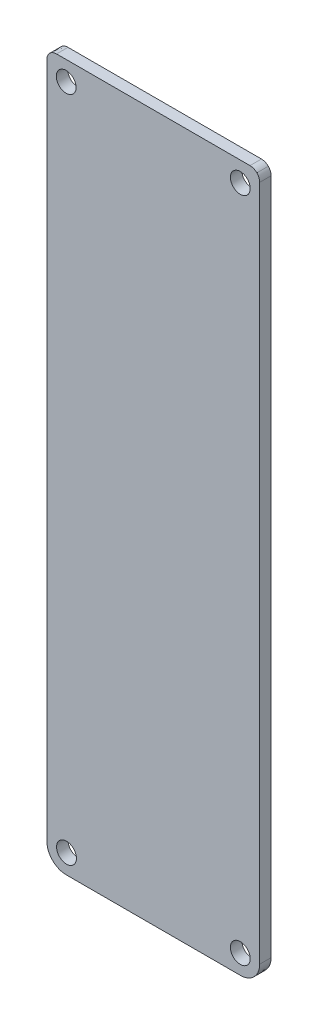
ISO-10303-21;
HEADER;
FILE_DESCRIPTION(('STEP AP214'),'2;1');
FILE_NAME('part.step','',(''),(''),'','','');
FILE_SCHEMA(('AUTOMOTIVE_DESIGN { 1 0 10303 214 1 1 1 1 }'));
ENDSEC;
DATA;
#1=APPLICATION_CONTEXT('core data for automotive mechanical design processes');
#2=APPLICATION_PROTOCOL_DEFINITION('international standard','automotive_design',2000,#1);
#3=PRODUCT_CONTEXT('',#1,'mechanical');
#4=PRODUCT('Part','Part','',(#3));
#5=PRODUCT_RELATED_PRODUCT_CATEGORY('part','',(#4));
#6=PRODUCT_DEFINITION_FORMATION('','',#4);
#7=PRODUCT_DEFINITION_CONTEXT('part definition',#1,'design');
#8=PRODUCT_DEFINITION('design','',#6,#7);
#9=PRODUCT_DEFINITION_SHAPE('','',#8);
#10=(LENGTH_UNIT() NAMED_UNIT(*) SI_UNIT(.MILLI.,.METRE.));
#11=(NAMED_UNIT(*) PLANE_ANGLE_UNIT() SI_UNIT($,.RADIAN.));
#12=(NAMED_UNIT(*) SI_UNIT($,.STERADIAN.) SOLID_ANGLE_UNIT());
#13=UNCERTAINTY_MEASURE_WITH_UNIT(LENGTH_MEASURE(1.E-05),#10,'distance_accuracy_value','');
#14=(GEOMETRIC_REPRESENTATION_CONTEXT(3) GLOBAL_UNCERTAINTY_ASSIGNED_CONTEXT((#13)) GLOBAL_UNIT_ASSIGNED_CONTEXT((#10,
#11,#12)) REPRESENTATION_CONTEXT('',''));
#15=CARTESIAN_POINT('',(0.,0.,0.));
#16=DIRECTION('',(0.,0.,1.));
#17=DIRECTION('',(1.,0.,0.));
#18=AXIS2_PLACEMENT_3D('',#15,#16,#17);
#19=CARTESIAN_POINT('',(110.49,-34.813931,1.5));
#20=CARTESIAN_POINT('',(110.49,-34.477106,1.5));
#21=CARTESIAN_POINT('',(110.356197,-34.154076,1.5));
#22=CARTESIAN_POINT('',(110.118026,-33.915905,1.5));
#23=B_SPLINE_CURVE_WITH_KNOTS('',3,(#19,#20,#21,#22),.UNSPECIFIED.,.F.,.F.,(4,4),(0.,1.),.UNSPECIFIED.);
#24=DIRECTION('',(0.,0.,-1.));
#25=VECTOR('',#24,1.);
#26=SURFACE_OF_LINEAR_EXTRUSION('',#23,#25);
#27=CARTESIAN_POINT('',(110.49,-34.813931,0.));
#28=CARTESIAN_POINT('',(110.49,-34.477106,0.));
#29=CARTESIAN_POINT('',(110.356197,-34.154076,0.));
#30=CARTESIAN_POINT('',(110.118026,-33.915905,0.));
#31=B_SPLINE_CURVE_WITH_KNOTS('',3,(#27,#28,#29,#30),.UNSPECIFIED.,.F.,.F.,(4,4),(0.,1.),.UNSPECIFIED.);
#32=CARTESIAN_POINT('',(110.49,-34.813931,0.));
#33=VERTEX_POINT('',#32);
#34=CARTESIAN_POINT('',(110.118026,-33.915905,0.));
#35=VERTEX_POINT('',#34);
#36=EDGE_CURVE('E268',#33,#35,#31,.T.);
#37=ORIENTED_EDGE('',*,*,#36,.T.);
#38=DIRECTION('',(0.,0.,-1.));
#39=VECTOR('',#38,1.);
#40=CARTESIAN_POINT('',(110.118026,-33.915905,1.5));
#41=LINE('',#40,#39);
#42=CARTESIAN_POINT('',(110.118026,-33.915905,1.5));
#43=VERTEX_POINT('',#42);
#44=EDGE_CURVE('E11',#43,#35,#41,.T.);
#45=ORIENTED_EDGE('',*,*,#44,.F.);
#46=CARTESIAN_POINT('',(110.49,-34.813931,1.5));
#47=VERTEX_POINT('',#46);
#48=EDGE_CURVE('E294',#47,#43,#23,.T.);
#49=ORIENTED_EDGE('',*,*,#48,.F.);
#50=DIRECTION('',(0.,0.,-1.));
#51=VECTOR('',#50,1.);
#52=CARTESIAN_POINT('',(110.49,-34.813931,1.5));
#53=LINE('',#52,#51);
#54=EDGE_CURVE('E163',#47,#33,#53,.T.);
#55=ORIENTED_EDGE('',*,*,#54,.T.);
#56=EDGE_LOOP('',(#37,#45,#49,#55));
#57=FACE_BOUND('',#56,.T.);
#58=ADVANCED_FACE('F36',(#57),#26,.F.);
#59=CARTESIAN_POINT('',(110.118026,-33.915905,1.5));
#60=CARTESIAN_POINT('',(109.879854,-33.677734,1.5));
#61=CARTESIAN_POINT('',(109.556825,-33.543931,1.5));
#62=CARTESIAN_POINT('',(109.22,-33.543931,1.5));
#63=B_SPLINE_CURVE_WITH_KNOTS('',3,(#59,#60,#61,#62),.UNSPECIFIED.,.F.,.F.,(4,4),(0.,1.),.UNSPECIFIED.);
#64=DIRECTION('',(0.,0.,-1.));
#65=VECTOR('',#64,1.);
#66=SURFACE_OF_LINEAR_EXTRUSION('',#63,#65);
#67=CARTESIAN_POINT('',(110.118026,-33.915905,0.));
#68=CARTESIAN_POINT('',(109.879854,-33.677734,0.));
#69=CARTESIAN_POINT('',(109.556825,-33.543931,0.));
#70=CARTESIAN_POINT('',(109.22,-33.543931,0.));
#71=B_SPLINE_CURVE_WITH_KNOTS('',3,(#67,#68,#69,#70),.UNSPECIFIED.,.F.,.F.,(4,4),(0.,1.),.UNSPECIFIED.);
#72=CARTESIAN_POINT('',(109.22,-33.543931,0.));
#73=VERTEX_POINT('',#72);
#74=EDGE_CURVE('E400',#35,#73,#71,.T.);
#75=ORIENTED_EDGE('',*,*,#74,.T.);
#76=DIRECTION('',(0.,0.,-1.));
#77=VECTOR('',#76,1.);
#78=CARTESIAN_POINT('',(109.22,-33.543931,1.5));
#79=LINE('',#78,#77);
#80=CARTESIAN_POINT('',(109.22,-33.543931,1.5));
#81=VERTEX_POINT('',#80);
#82=EDGE_CURVE('E47',#81,#73,#79,.T.);
#83=ORIENTED_EDGE('',*,*,#82,.F.);
#84=EDGE_CURVE('E109',#43,#81,#63,.T.);
#85=ORIENTED_EDGE('',*,*,#84,.F.);
#86=ORIENTED_EDGE('',*,*,#44,.T.);
#87=EDGE_LOOP('',(#75,#83,#85,#86));
#88=FACE_BOUND('',#87,.T.);
#89=ADVANCED_FACE('F312',(#88),#66,.F.);
#90=CARTESIAN_POINT('',(83.82,-33.543931,1.5));
#91=DIRECTION('',(0.,-1.,0.));
#92=DIRECTION('',(0.,0.,-1.));
#93=AXIS2_PLACEMENT_3D('',#90,#91,#92);
#94=PLANE('',#93);
#95=DIRECTION('',(-1.,0.,0.));
#96=VECTOR('',#95,1.);
#97=CARTESIAN_POINT('',(83.82,-33.543931,0.));
#98=LINE('',#97,#96);
#99=CARTESIAN_POINT('',(83.82,-33.543931,0.));
#100=VERTEX_POINT('',#99);
#101=EDGE_CURVE('E394',#73,#100,#98,.T.);
#102=ORIENTED_EDGE('',*,*,#101,.T.);
#103=DIRECTION('',(0.,0.,-1.));
#104=VECTOR('',#103,1.);
#105=CARTESIAN_POINT('',(83.82,-33.543931,1.5));
#106=LINE('',#105,#104);
#107=CARTESIAN_POINT('',(83.82,-33.543931,1.5));
#108=VERTEX_POINT('',#107);
#109=EDGE_CURVE('E221',#108,#100,#106,.T.);
#110=ORIENTED_EDGE('',*,*,#109,.F.);
#111=DIRECTION('',(-1.,0.,0.));
#112=VECTOR('',#111,1.);
#113=CARTESIAN_POINT('',(83.82,-33.543931,1.5));
#114=LINE('',#113,#112);
#115=EDGE_CURVE('E307',#81,#108,#114,.T.);
#116=ORIENTED_EDGE('',*,*,#115,.F.);
#117=ORIENTED_EDGE('',*,*,#82,.T.);
#118=EDGE_LOOP('',(#102,#110,#116,#117));
#119=FACE_BOUND('',#118,.T.);
#120=ADVANCED_FACE('F315',(#119),#94,.F.);
#121=CARTESIAN_POINT('',(83.82,-33.543931,1.5));
#122=CARTESIAN_POINT('',(83.483175,-33.543931,1.5));
#123=CARTESIAN_POINT('',(83.160146,-33.677734,1.5));
#124=CARTESIAN_POINT('',(82.921974,-33.915905,1.5));
#125=B_SPLINE_CURVE_WITH_KNOTS('',3,(#121,#122,#123,#124),.UNSPECIFIED.,.F.,.F.,(4,4),(0.,1.),.UNSPECIFIED.);
#126=DIRECTION('',(0.,0.,-1.));
#127=VECTOR('',#126,1.);
#128=SURFACE_OF_LINEAR_EXTRUSION('',#125,#127);
#129=CARTESIAN_POINT('',(83.82,-33.543931,0.));
#130=CARTESIAN_POINT('',(83.483175,-33.543931,0.));
#131=CARTESIAN_POINT('',(83.160146,-33.677734,0.));
#132=CARTESIAN_POINT('',(82.921974,-33.915905,0.));
#133=B_SPLINE_CURVE_WITH_KNOTS('',3,(#129,#130,#131,#132),.UNSPECIFIED.,.F.,.F.,(4,4),(0.,1.),.UNSPECIFIED.);
#134=CARTESIAN_POINT('',(82.921974,-33.915905,0.));
#135=VERTEX_POINT('',#134);
#136=EDGE_CURVE('E386',#100,#135,#133,.T.);
#137=ORIENTED_EDGE('',*,*,#136,.T.);
#138=DIRECTION('',(0.,0.,-1.));
#139=VECTOR('',#138,1.);
#140=CARTESIAN_POINT('',(82.921974,-33.915905,1.5));
#141=LINE('',#140,#139);
#142=CARTESIAN_POINT('',(82.921974,-33.915905,1.5));
#143=VERTEX_POINT('',#142);
#144=EDGE_CURVE('E231',#143,#135,#141,.T.);
#145=ORIENTED_EDGE('',*,*,#144,.F.);
#146=EDGE_CURVE('E325',#108,#143,#125,.T.);
#147=ORIENTED_EDGE('',*,*,#146,.F.);
#148=ORIENTED_EDGE('',*,*,#109,.T.);
#149=EDGE_LOOP('',(#137,#145,#147,#148));
#150=FACE_BOUND('',#149,.T.);
#151=ADVANCED_FACE('F318',(#150),#128,.F.);
#152=CARTESIAN_POINT('',(82.921974,-33.915905,1.5));
#153=CARTESIAN_POINT('',(82.683803,-34.154076,1.5));
#154=CARTESIAN_POINT('',(82.55,-34.477106,1.5));
#155=CARTESIAN_POINT('',(82.55,-34.813931,1.5));
#156=B_SPLINE_CURVE_WITH_KNOTS('',3,(#152,#153,#154,#155),.UNSPECIFIED.,.F.,.F.,(4,4),(0.,1.),.UNSPECIFIED.);
#157=DIRECTION('',(0.,0.,-1.));
#158=VECTOR('',#157,1.);
#159=SURFACE_OF_LINEAR_EXTRUSION('',#156,#158);
#160=CARTESIAN_POINT('',(82.921974,-33.915905,0.));
#161=CARTESIAN_POINT('',(82.683803,-34.154076,0.));
#162=CARTESIAN_POINT('',(82.55,-34.477106,0.));
#163=CARTESIAN_POINT('',(82.55,-34.813931,0.));
#164=B_SPLINE_CURVE_WITH_KNOTS('',3,(#160,#161,#162,#163),.UNSPECIFIED.,.F.,.F.,(4,4),(0.,1.),.UNSPECIFIED.);
#165=CARTESIAN_POINT('',(82.55,-34.813931,0.));
#166=VERTEX_POINT('',#165);
#167=EDGE_CURVE('E217',#135,#166,#164,.T.);
#168=ORIENTED_EDGE('',*,*,#167,.T.);
#169=DIRECTION('',(0.,0.,-1.));
#170=VECTOR('',#169,1.);
#171=CARTESIAN_POINT('',(82.55,-34.813931,1.5));
#172=LINE('',#171,#170);
#173=CARTESIAN_POINT('',(82.55,-34.813931,1.5));
#174=VERTEX_POINT('',#173);
#175=EDGE_CURVE('E233',#174,#166,#172,.T.);
#176=ORIENTED_EDGE('',*,*,#175,.F.);
#177=EDGE_CURVE('E329',#143,#174,#156,.T.);
#178=ORIENTED_EDGE('',*,*,#177,.F.);
#179=ORIENTED_EDGE('',*,*,#144,.T.);
#180=EDGE_LOOP('',(#168,#176,#178,#179));
#181=FACE_BOUND('',#180,.T.);
#182=ADVANCED_FACE('F322',(#181),#159,.F.);
#183=CARTESIAN_POINT('',(82.55,-39.893931,1.5));
#184=DIRECTION('',(1.,0.,0.));
#185=DIRECTION('',(0.,0.,-1.));
#186=AXIS2_PLACEMENT_3D('',#183,#184,#185);
#187=PLANE('',#186);
#188=DIRECTION('',(0.,-1.,0.));
#189=VECTOR('',#188,1.);
#190=CARTESIAN_POINT('',(82.55,-39.893931,0.));
#191=LINE('',#190,#189);
#192=CARTESIAN_POINT('',(82.55,-123.713931,0.));
#193=VERTEX_POINT('',#192);
#194=EDGE_CURVE('E214',#166,#193,#191,.T.);
#195=ORIENTED_EDGE('',*,*,#194,.T.);
#196=DIRECTION('',(0.,0.,-1.));
#197=VECTOR('',#196,1.);
#198=CARTESIAN_POINT('',(82.55,-123.713931,1.5));
#199=LINE('',#198,#197);
#200=CARTESIAN_POINT('',(82.55,-123.713931,1.5));
#201=VERTEX_POINT('',#200);
#202=EDGE_CURVE('E254',#201,#193,#199,.T.);
#203=ORIENTED_EDGE('',*,*,#202,.F.);
#204=DIRECTION('',(0.,-1.,0.));
#205=VECTOR('',#204,1.);
#206=CARTESIAN_POINT('',(82.55,-38.623931,1.5));
#207=LINE('',#206,#205);
#208=EDGE_CURVE('E224',#174,#201,#207,.T.);
#209=ORIENTED_EDGE('',*,*,#208,.F.);
#210=ORIENTED_EDGE('',*,*,#175,.T.);
#211=EDGE_LOOP('',(#195,#203,#209,#210));
#212=FACE_BOUND('',#211,.T.);
#213=ADVANCED_FACE('F348',(#212),#187,.F.);
#214=CARTESIAN_POINT('',(82.55,-123.713931,1.5));
#215=CARTESIAN_POINT('',(82.55,-124.387581,1.5));
#216=CARTESIAN_POINT('',(82.817606,-125.03364,1.5));
#217=CARTESIAN_POINT('',(83.293949,-125.509982,1.5));
#218=B_SPLINE_CURVE_WITH_KNOTS('',3,(#214,#215,#216,#217),.UNSPECIFIED.,.F.,.F.,(4,4),(0.,1.),.UNSPECIFIED.);
#219=DIRECTION('',(0.,0.,-1.));
#220=VECTOR('',#219,1.);
#221=SURFACE_OF_LINEAR_EXTRUSION('',#218,#220);
#222=CARTESIAN_POINT('',(82.55,-123.713931,0.));
#223=CARTESIAN_POINT('',(82.55,-124.387581,0.));
#224=CARTESIAN_POINT('',(82.817606,-125.03364,0.));
#225=CARTESIAN_POINT('',(83.293949,-125.509982,0.));
#226=B_SPLINE_CURVE_WITH_KNOTS('',3,(#222,#223,#224,#225),.UNSPECIFIED.,.F.,.F.,(4,4),(0.,1.),.UNSPECIFIED.);
#227=CARTESIAN_POINT('',(83.293949,-125.509982,0.));
#228=VERTEX_POINT('',#227);
#229=EDGE_CURVE('E216',#193,#228,#226,.T.);
#230=ORIENTED_EDGE('',*,*,#229,.T.);
#231=DIRECTION('',(0.,0.,-1.));
#232=VECTOR('',#231,1.);
#233=CARTESIAN_POINT('',(83.293949,-125.509982,1.5));
#234=LINE('',#233,#232);
#235=CARTESIAN_POINT('',(83.293949,-125.509982,1.5));
#236=VERTEX_POINT('',#235);
#237=EDGE_CURVE('E250',#236,#228,#234,.T.);
#238=ORIENTED_EDGE('',*,*,#237,.F.);
#239=EDGE_CURVE('E201',#201,#236,#218,.T.);
#240=ORIENTED_EDGE('',*,*,#239,.F.);
#241=ORIENTED_EDGE('',*,*,#202,.T.);
#242=EDGE_LOOP('',(#230,#238,#240,#241));
#243=FACE_BOUND('',#242,.T.);
#244=ADVANCED_FACE('F192',(#243),#221,.F.);
#245=CARTESIAN_POINT('',(83.293949,-125.509982,1.5));
#246=CARTESIAN_POINT('',(83.770291,-125.986325,1.5));
#247=CARTESIAN_POINT('',(84.41635,-126.253931,1.5));
#248=CARTESIAN_POINT('',(85.09,-126.253931,1.5));
#249=B_SPLINE_CURVE_WITH_KNOTS('',3,(#245,#246,#247,#248),.UNSPECIFIED.,.F.,.F.,(4,4),(0.,1.),.UNSPECIFIED.);
#250=DIRECTION('',(0.,0.,-1.));
#251=VECTOR('',#250,1.);
#252=SURFACE_OF_LINEAR_EXTRUSION('',#249,#251);
#253=CARTESIAN_POINT('',(83.293949,-125.509982,0.));
#254=CARTESIAN_POINT('',(83.770291,-125.986325,0.));
#255=CARTESIAN_POINT('',(84.41635,-126.253931,0.));
#256=CARTESIAN_POINT('',(85.09,-126.253931,0.));
#257=B_SPLINE_CURVE_WITH_KNOTS('',3,(#253,#254,#255,#256),.UNSPECIFIED.,.F.,.F.,(4,4),(0.,1.),.UNSPECIFIED.);
#258=CARTESIAN_POINT('',(85.09,-126.253931,0.));
#259=VERTEX_POINT('',#258);
#260=EDGE_CURVE('E225',#228,#259,#257,.T.);
#261=ORIENTED_EDGE('',*,*,#260,.T.);
#262=DIRECTION('',(0.,0.,-1.));
#263=VECTOR('',#262,1.);
#264=CARTESIAN_POINT('',(85.09,-126.253931,1.5));
#265=LINE('',#264,#263);
#266=CARTESIAN_POINT('',(85.09,-126.253931,1.5));
#267=VERTEX_POINT('',#266);
#268=EDGE_CURVE('E246',#267,#259,#265,.T.);
#269=ORIENTED_EDGE('',*,*,#268,.F.);
#270=EDGE_CURVE('E196',#236,#267,#249,.T.);
#271=ORIENTED_EDGE('',*,*,#270,.F.);
#272=ORIENTED_EDGE('',*,*,#237,.T.);
#273=EDGE_LOOP('',(#261,#269,#271,#272));
#274=FACE_BOUND('',#273,.T.);
#275=ADVANCED_FACE('F187',(#274),#252,.F.);
#276=CARTESIAN_POINT('',(85.09,-126.253931,1.5));
#277=DIRECTION('',(0.,1.,0.));
#278=DIRECTION('',(0.,0.,1.));
#279=AXIS2_PLACEMENT_3D('',#276,#277,#278);
#280=PLANE('',#279);
#281=DIRECTION('',(1.,0.,0.));
#282=VECTOR('',#281,1.);
#283=CARTESIAN_POINT('',(85.09,-126.253931,0.));
#284=LINE('',#283,#282);
#285=CARTESIAN_POINT('',(107.95,-126.253931,0.));
#286=VERTEX_POINT('',#285);
#287=EDGE_CURVE('E227',#259,#286,#284,.T.);
#288=ORIENTED_EDGE('',*,*,#287,.T.);
#289=DIRECTION('',(0.,0.,-1.));
#290=VECTOR('',#289,1.);
#291=CARTESIAN_POINT('',(107.95,-126.253931,1.5));
#292=LINE('',#291,#290);
#293=CARTESIAN_POINT('',(107.95,-126.253931,1.5));
#294=VERTEX_POINT('',#293);
#295=EDGE_CURVE('E154',#294,#286,#292,.T.);
#296=ORIENTED_EDGE('',*,*,#295,.F.);
#297=DIRECTION('',(1.,0.,0.));
#298=VECTOR('',#297,1.);
#299=CARTESIAN_POINT('',(85.09,-126.253931,1.5));
#300=LINE('',#299,#298);
#301=EDGE_CURVE('E141',#267,#294,#300,.T.);
#302=ORIENTED_EDGE('',*,*,#301,.F.);
#303=ORIENTED_EDGE('',*,*,#268,.T.);
#304=EDGE_LOOP('',(#288,#296,#302,#303));
#305=FACE_BOUND('',#304,.T.);
#306=ADVANCED_FACE('F184',(#305),#280,.F.);
#307=CARTESIAN_POINT('',(107.95,-126.253931,1.5));
#308=CARTESIAN_POINT('',(108.62365,-126.253931,1.5));
#309=CARTESIAN_POINT('',(109.269709,-125.986325,1.5));
#310=CARTESIAN_POINT('',(109.746051,-125.509982,1.5));
#311=B_SPLINE_CURVE_WITH_KNOTS('',3,(#307,#308,#309,#310),.UNSPECIFIED.,.F.,.F.,(4,4),(0.,1.),.UNSPECIFIED.);
#312=DIRECTION('',(0.,0.,-1.));
#313=VECTOR('',#312,1.);
#314=SURFACE_OF_LINEAR_EXTRUSION('',#311,#313);
#315=CARTESIAN_POINT('',(107.95,-126.253931,0.));
#316=CARTESIAN_POINT('',(108.62365,-126.253931,0.));
#317=CARTESIAN_POINT('',(109.269709,-125.986325,0.));
#318=CARTESIAN_POINT('',(109.746051,-125.509982,0.));
#319=B_SPLINE_CURVE_WITH_KNOTS('',3,(#315,#316,#317,#318),.UNSPECIFIED.,.F.,.F.,(4,4),(0.,1.),.UNSPECIFIED.);
#320=CARTESIAN_POINT('',(109.746051,-125.509982,0.));
#321=VERTEX_POINT('',#320);
#322=EDGE_CURVE('E151',#286,#321,#319,.T.);
#323=ORIENTED_EDGE('',*,*,#322,.T.);
#324=DIRECTION('',(0.,0.,-1.));
#325=VECTOR('',#324,1.);
#326=CARTESIAN_POINT('',(109.746051,-125.509982,1.5));
#327=LINE('',#326,#325);
#328=CARTESIAN_POINT('',(109.746051,-125.509982,1.5));
#329=VERTEX_POINT('',#328);
#330=EDGE_CURVE('E148',#329,#321,#327,.T.);
#331=ORIENTED_EDGE('',*,*,#330,.F.);
#332=EDGE_CURVE('E134',#294,#329,#311,.T.);
#333=ORIENTED_EDGE('',*,*,#332,.F.);
#334=ORIENTED_EDGE('',*,*,#295,.T.);
#335=EDGE_LOOP('',(#323,#331,#333,#334));
#336=FACE_BOUND('',#335,.T.);
#337=ADVANCED_FACE('F149',(#336),#314,.F.);
#338=CARTESIAN_POINT('',(109.746051,-125.509982,1.5));
#339=CARTESIAN_POINT('',(110.222394,-125.03364,1.5));
#340=CARTESIAN_POINT('',(110.49,-124.387581,1.5));
#341=CARTESIAN_POINT('',(110.49,-123.713931,1.5));
#342=B_SPLINE_CURVE_WITH_KNOTS('',3,(#338,#339,#340,#341),.UNSPECIFIED.,.F.,.F.,(4,4),(0.,1.),.UNSPECIFIED.);
#343=DIRECTION('',(0.,0.,-1.));
#344=VECTOR('',#343,1.);
#345=SURFACE_OF_LINEAR_EXTRUSION('',#342,#344);
#346=CARTESIAN_POINT('',(109.746051,-125.509982,0.));
#347=CARTESIAN_POINT('',(110.222394,-125.03364,0.));
#348=CARTESIAN_POINT('',(110.49,-124.387581,0.));
#349=CARTESIAN_POINT('',(110.49,-123.713931,0.));
#350=B_SPLINE_CURVE_WITH_KNOTS('',3,(#346,#347,#348,#349),.UNSPECIFIED.,.F.,.F.,(4,4),(0.,1.),.UNSPECIFIED.);
#351=CARTESIAN_POINT('',(110.49,-123.713931,0.));
#352=VERTEX_POINT('',#351);
#353=EDGE_CURVE('E356',#321,#352,#350,.T.);
#354=ORIENTED_EDGE('',*,*,#353,.T.);
#355=DIRECTION('',(0.,0.,-1.));
#356=VECTOR('',#355,1.);
#357=CARTESIAN_POINT('',(110.49,-123.713931,1.5));
#358=LINE('',#357,#356);
#359=CARTESIAN_POINT('',(110.49,-123.713931,1.5));
#360=VERTEX_POINT('',#359);
#361=EDGE_CURVE('E155',#360,#352,#358,.T.);
#362=ORIENTED_EDGE('',*,*,#361,.F.);
#363=EDGE_CURVE('E138',#329,#360,#342,.T.);
#364=ORIENTED_EDGE('',*,*,#363,.F.);
#365=ORIENTED_EDGE('',*,*,#330,.T.);
#366=EDGE_LOOP('',(#354,#362,#364,#365));
#367=FACE_BOUND('',#366,.T.);
#368=ADVANCED_FACE('F157',(#367),#345,.F.);
#369=CARTESIAN_POINT('',(110.49,-34.813931,1.5));
#370=DIRECTION('',(-1.,0.,0.));
#371=DIRECTION('',(0.,0.,1.));
#372=AXIS2_PLACEMENT_3D('',#369,#370,#371);
#373=PLANE('',#372);
#374=DIRECTION('',(0.,1.,0.));
#375=VECTOR('',#374,1.);
#376=CARTESIAN_POINT('',(110.49,-34.813931,0.));
#377=LINE('',#376,#375);
#378=EDGE_CURVE('E97',#352,#33,#377,.T.);
#379=ORIENTED_EDGE('',*,*,#378,.T.);
#380=ORIENTED_EDGE('',*,*,#54,.F.);
#381=DIRECTION('',(0.,1.,0.));
#382=VECTOR('',#381,1.);
#383=CARTESIAN_POINT('',(110.49,-39.893931,1.5));
#384=LINE('',#383,#382);
#385=EDGE_CURVE('E56',#360,#47,#384,.T.);
#386=ORIENTED_EDGE('',*,*,#385,.F.);
#387=ORIENTED_EDGE('',*,*,#361,.T.);
#388=EDGE_LOOP('',(#379,#380,#386,#387));
#389=FACE_BOUND('',#388,.T.);
#390=ADVANCED_FACE('F180',(#389),#373,.F.);
#391=CARTESIAN_POINT('',(110.393327125,-34.32792275,1.5));
#392=DIRECTION('',(0.,0.,-1.));
#393=DIRECTION('',(-1.,0.,0.));
#394=AXIS2_PLACEMENT_3D('',#391,#392,#393);
#395=PLANE('',#394);
#396=CARTESIAN_POINT('',(107.943434753132,-123.713931,1.5));
#397=DIRECTION('',(0.,0.,1.));
#398=DIRECTION('',(1.,0.,0.));
#399=AXIS2_PLACEMENT_3D('',#396,#397,#398);
#400=CIRCLE('',#399,1.29999999999999);
#401=CARTESIAN_POINT('',(109.243434753132,-123.713931,1.5));
#402=VERTEX_POINT('',#401);
#403=EDGE_CURVE('E212',#402,#402,#400,.T.);
#404=ORIENTED_EDGE('',*,*,#403,.F.);
#405=EDGE_LOOP('',(#404));
#406=FACE_BOUND('',#405,.T.);
#407=CARTESIAN_POINT('',(107.943434753132,-36.1485745359487,1.5));
#408=DIRECTION('',(0.,0.,1.));
#409=DIRECTION('',(1.,0.,0.));
#410=AXIS2_PLACEMENT_3D('',#407,#408,#409);
#411=CIRCLE('',#410,1.29999999999999);
#412=CARTESIAN_POINT('',(109.243434753132,-36.1485745359487,1.5));
#413=VERTEX_POINT('',#412);
#414=EDGE_CURVE('E587',#413,#413,#411,.T.);
#415=ORIENTED_EDGE('',*,*,#414,.F.);
#416=EDGE_LOOP('',(#415));
#417=FACE_BOUND('',#416,.T.);
#418=CARTESIAN_POINT('',(85.0841373246273,-36.0912808743247,1.5));
#419=DIRECTION('',(0.,0.,1.));
#420=DIRECTION('',(1.,0.,0.));
#421=AXIS2_PLACEMENT_3D('',#418,#419,#420);
#422=CIRCLE('',#421,1.29999999999999);
#423=CARTESIAN_POINT('',(86.3841373246273,-36.0912808743247,1.5));
#424=VERTEX_POINT('',#423);
#425=EDGE_CURVE('E292',#424,#424,#422,.T.);
#426=ORIENTED_EDGE('',*,*,#425,.F.);
#427=EDGE_LOOP('',(#426));
#428=FACE_BOUND('',#427,.T.);
#429=CARTESIAN_POINT('',(85.1247717146963,-123.713931,1.5));
#430=DIRECTION('',(0.,0.,1.));
#431=DIRECTION('',(1.,0.,0.));
#432=AXIS2_PLACEMENT_3D('',#429,#430,#431);
#433=CIRCLE('',#432,1.30477171469628);
#434=CARTESIAN_POINT('',(86.4295434293925,-123.713931,1.5));
#435=VERTEX_POINT('',#434);
#436=EDGE_CURVE('E269',#435,#435,#433,.T.);
#437=ORIENTED_EDGE('',*,*,#436,.F.);
#438=EDGE_LOOP('',(#437));
#439=FACE_BOUND('',#438,.T.);
#440=ORIENTED_EDGE('',*,*,#48,.T.);
#441=ORIENTED_EDGE('',*,*,#84,.T.);
#442=ORIENTED_EDGE('',*,*,#115,.T.);
#443=ORIENTED_EDGE('',*,*,#146,.T.);
#444=ORIENTED_EDGE('',*,*,#177,.T.);
#445=ORIENTED_EDGE('',*,*,#208,.T.);
#446=ORIENTED_EDGE('',*,*,#239,.T.);
#447=ORIENTED_EDGE('',*,*,#270,.T.);
#448=ORIENTED_EDGE('',*,*,#301,.T.);
#449=ORIENTED_EDGE('',*,*,#332,.T.);
#450=ORIENTED_EDGE('',*,*,#363,.T.);
#451=ORIENTED_EDGE('',*,*,#385,.T.);
#452=EDGE_LOOP('',(#440,#441,#442,#443,#444,#445,#446,#447,#448,#449,#450,#451));
#453=FACE_BOUND('',#452,.T.);
#454=ADVANCED_FACE('F136',(#406,#417,#428,#439,#453),#395,.F.);
#455=CARTESIAN_POINT('',(110.393327125,-34.32792275,0.));
#456=DIRECTION('',(0.,0.,-1.));
#457=DIRECTION('',(-1.,0.,0.));
#458=AXIS2_PLACEMENT_3D('',#455,#456,#457);
#459=PLANE('',#458);
#460=CARTESIAN_POINT('',(107.943434753132,-123.713931,0.));
#461=DIRECTION('',(0.,0.,-1.));
#462=DIRECTION('',(-1.,0.,0.));
#463=AXIS2_PLACEMENT_3D('',#460,#461,#462);
#464=CIRCLE('',#463,1.29999999999999);
#465=CARTESIAN_POINT('',(106.643434753132,-123.713931,0.));
#466=VERTEX_POINT('',#465);
#467=EDGE_CURVE('E40',#466,#466,#464,.T.);
#468=ORIENTED_EDGE('',*,*,#467,.F.);
#469=EDGE_LOOP('',(#468));
#470=FACE_BOUND('',#469,.T.);
#471=CARTESIAN_POINT('',(107.943434753132,-36.1485745359487,0.));
#472=DIRECTION('',(0.,0.,-1.));
#473=DIRECTION('',(-1.,0.,0.));
#474=AXIS2_PLACEMENT_3D('',#471,#472,#473);
#475=CIRCLE('',#474,1.29999999999999);
#476=CARTESIAN_POINT('',(106.643434753132,-36.1485745359487,0.));
#477=VERTEX_POINT('',#476);
#478=EDGE_CURVE('E273',#477,#477,#475,.T.);
#479=ORIENTED_EDGE('',*,*,#478,.F.);
#480=EDGE_LOOP('',(#479));
#481=FACE_BOUND('',#480,.T.);
#482=CARTESIAN_POINT('',(85.0841373246273,-36.0912808743247,0.));
#483=DIRECTION('',(0.,0.,-1.));
#484=DIRECTION('',(-1.,0.,0.));
#485=AXIS2_PLACEMENT_3D('',#482,#483,#484);
#486=CIRCLE('',#485,1.29999999999999);
#487=CARTESIAN_POINT('',(83.7841373246273,-36.0912808743247,0.));
#488=VERTEX_POINT('',#487);
#489=EDGE_CURVE('E270',#488,#488,#486,.T.);
#490=ORIENTED_EDGE('',*,*,#489,.F.);
#491=EDGE_LOOP('',(#490));
#492=FACE_BOUND('',#491,.T.);
#493=CARTESIAN_POINT('',(85.1247717146963,-123.713931,0.));
#494=DIRECTION('',(0.,0.,-1.));
#495=DIRECTION('',(-1.,0.,0.));
#496=AXIS2_PLACEMENT_3D('',#493,#494,#495);
#497=CIRCLE('',#496,1.30477171469628);
#498=CARTESIAN_POINT('',(83.82,-123.713931,0.));
#499=VERTEX_POINT('',#498);
#500=EDGE_CURVE('E264',#499,#499,#497,.T.);
#501=ORIENTED_EDGE('',*,*,#500,.F.);
#502=EDGE_LOOP('',(#501));
#503=FACE_BOUND('',#502,.T.);
#504=ORIENTED_EDGE('',*,*,#36,.F.);
#505=ORIENTED_EDGE('',*,*,#378,.F.);
#506=ORIENTED_EDGE('',*,*,#353,.F.);
#507=ORIENTED_EDGE('',*,*,#322,.F.);
#508=ORIENTED_EDGE('',*,*,#287,.F.);
#509=ORIENTED_EDGE('',*,*,#260,.F.);
#510=ORIENTED_EDGE('',*,*,#229,.F.);
#511=ORIENTED_EDGE('',*,*,#194,.F.);
#512=ORIENTED_EDGE('',*,*,#167,.F.);
#513=ORIENTED_EDGE('',*,*,#136,.F.);
#514=ORIENTED_EDGE('',*,*,#101,.F.);
#515=ORIENTED_EDGE('',*,*,#74,.F.);
#516=EDGE_LOOP('',(#504,#505,#506,#507,#508,#509,#510,#511,#512,#513,#514,#515));
#517=FACE_BOUND('',#516,.T.);
#518=ADVANCED_FACE('F355',(#470,#481,#492,#503,#517),#459,.T.);
#519=CARTESIAN_POINT('',(85.1247717146963,-123.713931,-8.5));
#520=DIRECTION('',(0.,0.,1.));
#521=DIRECTION('',(1.,0.,0.));
#522=AXIS2_PLACEMENT_3D('',#519,#520,#521);
#523=CYLINDRICAL_SURFACE('',#522,1.30477171469628);
#524=ORIENTED_EDGE('',*,*,#500,.T.);
#525=EDGE_LOOP('',(#524));
#526=FACE_BOUND('',#525,.T.);
#527=ORIENTED_EDGE('',*,*,#436,.T.);
#528=EDGE_LOOP('',(#527));
#529=FACE_BOUND('',#528,.T.);
#530=ADVANCED_FACE('F494',(#526,#529),#523,.F.);
#531=CARTESIAN_POINT('',(85.0841373246273,-36.0912808743247,-8.5));
#532=DIRECTION('',(0.,0.,1.));
#533=DIRECTION('',(1.,0.,0.));
#534=AXIS2_PLACEMENT_3D('',#531,#532,#533);
#535=CYLINDRICAL_SURFACE('',#534,1.29999999999999);
#536=ORIENTED_EDGE('',*,*,#489,.T.);
#537=EDGE_LOOP('',(#536));
#538=FACE_BOUND('',#537,.T.);
#539=ORIENTED_EDGE('',*,*,#425,.T.);
#540=EDGE_LOOP('',(#539));
#541=FACE_BOUND('',#540,.T.);
#542=ADVANCED_FACE('F502',(#538,#541),#535,.F.);
#543=CARTESIAN_POINT('',(107.943434753132,-36.1485745359487,-8.5));
#544=DIRECTION('',(0.,0.,1.));
#545=DIRECTION('',(1.,0.,0.));
#546=AXIS2_PLACEMENT_3D('',#543,#544,#545);
#547=CYLINDRICAL_SURFACE('',#546,1.29999999999999);
#548=ORIENTED_EDGE('',*,*,#478,.T.);
#549=EDGE_LOOP('',(#548));
#550=FACE_BOUND('',#549,.T.);
#551=ORIENTED_EDGE('',*,*,#414,.T.);
#552=EDGE_LOOP('',(#551));
#553=FACE_BOUND('',#552,.T.);
#554=ADVANCED_FACE('F510',(#550,#553),#547,.F.);
#555=CARTESIAN_POINT('',(107.943434753132,-123.713931,-8.5));
#556=DIRECTION('',(0.,0.,1.));
#557=DIRECTION('',(1.,0.,0.));
#558=AXIS2_PLACEMENT_3D('',#555,#556,#557);
#559=CYLINDRICAL_SURFACE('',#558,1.29999999999999);
#560=ORIENTED_EDGE('',*,*,#467,.T.);
#561=EDGE_LOOP('',(#560));
#562=FACE_BOUND('',#561,.T.);
#563=ORIENTED_EDGE('',*,*,#403,.T.);
#564=EDGE_LOOP('',(#563));
#565=FACE_BOUND('',#564,.T.);
#566=ADVANCED_FACE('F519',(#562,#565),#559,.F.);
#567=CLOSED_SHELL('',(#58,#89,#120,#151,#182,#213,#244,#275,#306,#337,#368,#390,#454,#518,#530,
#542,#554,#566));
#568=MANIFOLD_SOLID_BREP('B2',#567);
#569=ADVANCED_BREP_SHAPE_REPRESENTATION('',(#18,#568),#14);
#570=SHAPE_DEFINITION_REPRESENTATION(#9,#569);
ENDSEC;
END-ISO-10303-21;
